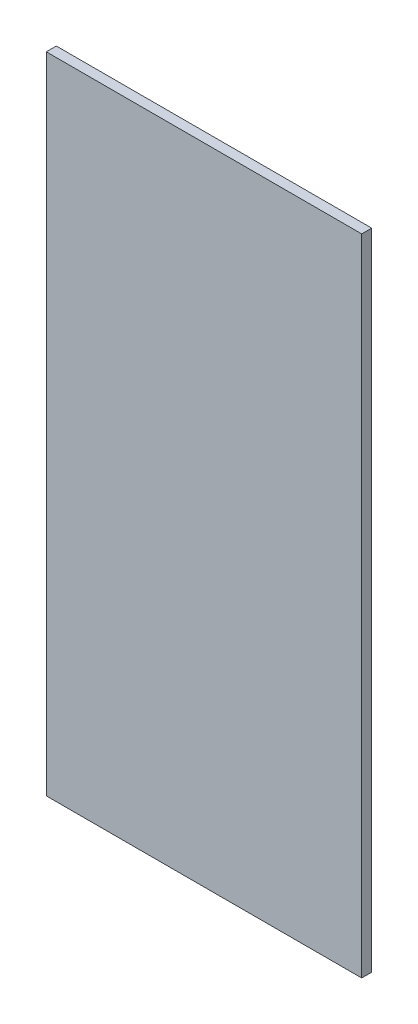
ISO-10303-21;
HEADER;
FILE_DESCRIPTION(('STEP AP214'),'2;1');
FILE_NAME('part.step','',(''),(''),'','','');
FILE_SCHEMA(('AUTOMOTIVE_DESIGN { 1 0 10303 214 1 1 1 1 }'));
ENDSEC;
DATA;
#1=APPLICATION_CONTEXT('core data for automotive mechanical design processes');
#2=APPLICATION_PROTOCOL_DEFINITION('international standard','automotive_design',2000,#1);
#3=PRODUCT_CONTEXT('',#1,'mechanical');
#4=PRODUCT('Part','Part','',(#3));
#5=PRODUCT_RELATED_PRODUCT_CATEGORY('part','',(#4));
#6=PRODUCT_DEFINITION_FORMATION('','',#4);
#7=PRODUCT_DEFINITION_CONTEXT('part definition',#1,'design');
#8=PRODUCT_DEFINITION('design','',#6,#7);
#9=PRODUCT_DEFINITION_SHAPE('','',#8);
#10=(LENGTH_UNIT() NAMED_UNIT(*) SI_UNIT(.MILLI.,.METRE.));
#11=(NAMED_UNIT(*) PLANE_ANGLE_UNIT() SI_UNIT($,.RADIAN.));
#12=(NAMED_UNIT(*) SI_UNIT($,.STERADIAN.) SOLID_ANGLE_UNIT());
#13=UNCERTAINTY_MEASURE_WITH_UNIT(LENGTH_MEASURE(1.E-05),#10,'distance_accuracy_value','');
#14=(GEOMETRIC_REPRESENTATION_CONTEXT(3) GLOBAL_UNCERTAINTY_ASSIGNED_CONTEXT((#13)) GLOBAL_UNIT_ASSIGNED_CONTEXT((#10,
#11,#12)) REPRESENTATION_CONTEXT('',''));
#15=CARTESIAN_POINT('',(0.,0.,0.));
#16=DIRECTION('',(0.,0.,1.));
#17=DIRECTION('',(1.,0.,0.));
#18=AXIS2_PLACEMENT_3D('',#15,#16,#17);
#19=CARTESIAN_POINT('',(0.,0.,7.));
#20=DIRECTION('',(1.,0.,0.));
#21=DIRECTION('',(0.,0.,-1.));
#22=AXIS2_PLACEMENT_3D('',#19,#20,#21);
#23=PLANE('',#22);
#24=DIRECTION('',(0.,-1.,0.));
#25=VECTOR('',#24,1.);
#26=CARTESIAN_POINT('',(0.,0.,0.));
#27=LINE('',#26,#25);
#28=CARTESIAN_POINT('',(0.,450.,0.));
#29=VERTEX_POINT('',#28);
#30=CARTESIAN_POINT('',(0.,0.,0.));
#31=VERTEX_POINT('',#30);
#32=EDGE_CURVE('E107',#29,#31,#27,.T.);
#33=ORIENTED_EDGE('',*,*,#32,.T.);
#34=DIRECTION('',(0.,0.,-1.));
#35=VECTOR('',#34,1.);
#36=CARTESIAN_POINT('',(0.,0.,7.));
#37=LINE('',#36,#35);
#38=CARTESIAN_POINT('',(0.,0.,7.));
#39=VERTEX_POINT('',#38);
#40=EDGE_CURVE('E11',#39,#31,#37,.T.);
#41=ORIENTED_EDGE('',*,*,#40,.F.);
#42=DIRECTION('',(0.,-1.,0.));
#43=VECTOR('',#42,1.);
#44=CARTESIAN_POINT('',(0.,0.,7.));
#45=LINE('',#44,#43);
#46=CARTESIAN_POINT('',(0.,450.,7.));
#47=VERTEX_POINT('',#46);
#48=EDGE_CURVE('E91',#47,#39,#45,.T.);
#49=ORIENTED_EDGE('',*,*,#48,.F.);
#50=DIRECTION('',(0.,0.,-1.));
#51=VECTOR('',#50,1.);
#52=CARTESIAN_POINT('',(0.,450.,7.));
#53=LINE('',#52,#51);
#54=EDGE_CURVE('E103',#47,#29,#53,.T.);
#55=ORIENTED_EDGE('',*,*,#54,.T.);
#56=EDGE_LOOP('',(#33,#41,#49,#55));
#57=FACE_BOUND('',#56,.T.);
#58=ADVANCED_FACE('F39',(#57),#23,.F.);
#59=CARTESIAN_POINT('',(0.,0.,7.));
#60=DIRECTION('',(0.,1.,0.));
#61=DIRECTION('',(0.,0.,1.));
#62=AXIS2_PLACEMENT_3D('',#59,#60,#61);
#63=PLANE('',#62);
#64=DIRECTION('',(1.,0.,0.));
#65=VECTOR('',#64,1.);
#66=CARTESIAN_POINT('',(0.,0.,0.));
#67=LINE('',#66,#65);
#68=CARTESIAN_POINT('',(220.27,0.,0.));
#69=VERTEX_POINT('',#68);
#70=EDGE_CURVE('E96',#31,#69,#67,.T.);
#71=ORIENTED_EDGE('',*,*,#70,.T.);
#72=DIRECTION('',(0.,0.,-1.));
#73=VECTOR('',#72,1.);
#74=CARTESIAN_POINT('',(220.27,0.,7.));
#75=LINE('',#74,#73);
#76=CARTESIAN_POINT('',(220.27,0.,7.));
#77=VERTEX_POINT('',#76);
#78=EDGE_CURVE('E48',#77,#69,#75,.T.);
#79=ORIENTED_EDGE('',*,*,#78,.F.);
#80=DIRECTION('',(1.,0.,0.));
#81=VECTOR('',#80,1.);
#82=CARTESIAN_POINT('',(0.,0.,7.));
#83=LINE('',#82,#81);
#84=EDGE_CURVE('E86',#39,#77,#83,.T.);
#85=ORIENTED_EDGE('',*,*,#84,.F.);
#86=ORIENTED_EDGE('',*,*,#40,.T.);
#87=EDGE_LOOP('',(#71,#79,#85,#86));
#88=FACE_BOUND('',#87,.T.);
#89=ADVANCED_FACE('F95',(#88),#63,.F.);
#90=CARTESIAN_POINT('',(220.27,0.,7.));
#91=DIRECTION('',(-1.,0.,0.));
#92=DIRECTION('',(0.,0.,1.));
#93=AXIS2_PLACEMENT_3D('',#90,#91,#92);
#94=PLANE('',#93);
#95=DIRECTION('',(0.,1.,0.));
#96=VECTOR('',#95,1.);
#97=CARTESIAN_POINT('',(220.27,0.,0.));
#98=LINE('',#97,#96);
#99=CARTESIAN_POINT('',(220.27,450.,0.));
#100=VERTEX_POINT('',#99);
#101=EDGE_CURVE('E73',#69,#100,#98,.T.);
#102=ORIENTED_EDGE('',*,*,#101,.T.);
#103=DIRECTION('',(0.,0.,-1.));
#104=VECTOR('',#103,1.);
#105=CARTESIAN_POINT('',(220.27,450.,7.));
#106=LINE('',#105,#104);
#107=CARTESIAN_POINT('',(220.27,450.,7.));
#108=VERTEX_POINT('',#107);
#109=EDGE_CURVE('E98',#108,#100,#106,.T.);
#110=ORIENTED_EDGE('',*,*,#109,.F.);
#111=DIRECTION('',(0.,1.,0.));
#112=VECTOR('',#111,1.);
#113=CARTESIAN_POINT('',(220.27,0.,7.));
#114=LINE('',#113,#112);
#115=EDGE_CURVE('E89',#77,#108,#114,.T.);
#116=ORIENTED_EDGE('',*,*,#115,.F.);
#117=ORIENTED_EDGE('',*,*,#78,.T.);
#118=EDGE_LOOP('',(#102,#110,#116,#117));
#119=FACE_BOUND('',#118,.T.);
#120=ADVANCED_FACE('F99',(#119),#94,.F.);
#121=CARTESIAN_POINT('',(0.,450.,7.));
#122=DIRECTION('',(0.,-1.,0.));
#123=DIRECTION('',(0.,0.,-1.));
#124=AXIS2_PLACEMENT_3D('',#121,#122,#123);
#125=PLANE('',#124);
#126=DIRECTION('',(-1.,0.,0.));
#127=VECTOR('',#126,1.);
#128=CARTESIAN_POINT('',(0.,450.,0.));
#129=LINE('',#128,#127);
#130=EDGE_CURVE('E79',#100,#29,#129,.T.);
#131=ORIENTED_EDGE('',*,*,#130,.T.);
#132=ORIENTED_EDGE('',*,*,#54,.F.);
#133=DIRECTION('',(-1.,0.,0.));
#134=VECTOR('',#133,1.);
#135=CARTESIAN_POINT('',(0.,450.,7.));
#136=LINE('',#135,#134);
#137=EDGE_CURVE('E56',#108,#47,#136,.T.);
#138=ORIENTED_EDGE('',*,*,#137,.F.);
#139=ORIENTED_EDGE('',*,*,#109,.T.);
#140=EDGE_LOOP('',(#131,#132,#138,#139));
#141=FACE_BOUND('',#140,.T.);
#142=ADVANCED_FACE('F120',(#141),#125,.F.);
#143=CARTESIAN_POINT('',(0.,0.,7.));
#144=DIRECTION('',(0.,0.,-1.));
#145=DIRECTION('',(-1.,0.,0.));
#146=AXIS2_PLACEMENT_3D('',#143,#144,#145);
#147=PLANE('',#146);
#148=ORIENTED_EDGE('',*,*,#48,.T.);
#149=ORIENTED_EDGE('',*,*,#84,.T.);
#150=ORIENTED_EDGE('',*,*,#115,.T.);
#151=ORIENTED_EDGE('',*,*,#137,.T.);
#152=EDGE_LOOP('',(#148,#149,#150,#151));
#153=FACE_BOUND('',#152,.T.);
#154=ADVANCED_FACE('F87',(#153),#147,.F.);
#155=CARTESIAN_POINT('',(0.,0.,0.));
#156=DIRECTION('',(0.,0.,-1.));
#157=DIRECTION('',(-1.,0.,0.));
#158=AXIS2_PLACEMENT_3D('',#155,#156,#157);
#159=PLANE('',#158);
#160=ORIENTED_EDGE('',*,*,#32,.F.);
#161=ORIENTED_EDGE('',*,*,#130,.F.);
#162=ORIENTED_EDGE('',*,*,#101,.F.);
#163=ORIENTED_EDGE('',*,*,#70,.F.);
#164=EDGE_LOOP('',(#160,#161,#162,#163));
#165=FACE_BOUND('',#164,.T.);
#166=ADVANCED_FACE('F123',(#165),#159,.T.);
#167=CLOSED_SHELL('',(#58,#89,#120,#142,#154,#166));
#168=MANIFOLD_SOLID_BREP('B2',#167);
#169=ADVANCED_BREP_SHAPE_REPRESENTATION('',(#18,#168),#14);
#170=SHAPE_DEFINITION_REPRESENTATION(#9,#169);
ENDSEC;
END-ISO-10303-21;
